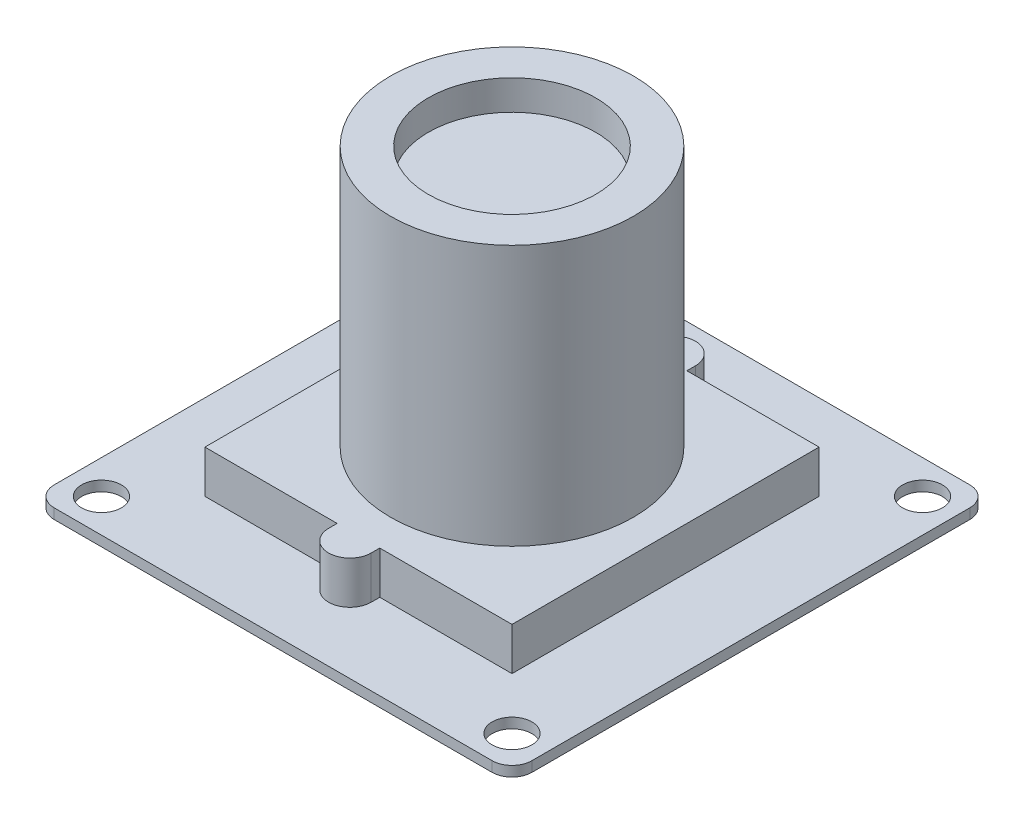
ISO-10303-21;
HEADER;
FILE_DESCRIPTION(('STEP AP214'),'2;1');
FILE_NAME('part.step','',(''),(''),'','','');
FILE_SCHEMA(('AUTOMOTIVE_DESIGN { 1 0 10303 214 1 1 1 1 }'));
ENDSEC;
DATA;
#1=APPLICATION_CONTEXT('core data for automotive mechanical design processes');
#2=APPLICATION_PROTOCOL_DEFINITION('international standard','automotive_design',2000,#1);
#3=PRODUCT_CONTEXT('',#1,'mechanical');
#4=PRODUCT('Part','Part','',(#3));
#5=PRODUCT_RELATED_PRODUCT_CATEGORY('part','',(#4));
#6=PRODUCT_DEFINITION_FORMATION('','',#4);
#7=PRODUCT_DEFINITION_CONTEXT('part definition',#1,'design');
#8=PRODUCT_DEFINITION('design','',#6,#7);
#9=PRODUCT_DEFINITION_SHAPE('','',#8);
#10=(LENGTH_UNIT() NAMED_UNIT(*) SI_UNIT(.MILLI.,.METRE.));
#11=(NAMED_UNIT(*) PLANE_ANGLE_UNIT() SI_UNIT($,.RADIAN.));
#12=(NAMED_UNIT(*) SI_UNIT($,.STERADIAN.) SOLID_ANGLE_UNIT());
#13=UNCERTAINTY_MEASURE_WITH_UNIT(LENGTH_MEASURE(1.E-05),#10,'distance_accuracy_value','');
#14=(GEOMETRIC_REPRESENTATION_CONTEXT(3) GLOBAL_UNCERTAINTY_ASSIGNED_CONTEXT((#13)) GLOBAL_UNIT_ASSIGNED_CONTEXT((#10,
#11,#12)) REPRESENTATION_CONTEXT('',''));
#15=CARTESIAN_POINT('',(0.,0.,0.));
#16=DIRECTION('',(0.,0.,1.));
#17=DIRECTION('',(1.,0.,0.));
#18=AXIS2_PLACEMENT_3D('',#15,#16,#17);
#19=CARTESIAN_POINT('',(0.,3.538,0.));
#20=DIRECTION('',(0.,1.,0.));
#21=DIRECTION('',(0.,0.,1.));
#22=AXIS2_PLACEMENT_3D('',#19,#20,#21);
#23=PLANE('',#22);
#24=CARTESIAN_POINT('',(0.,3.538,10.857));
#25=DIRECTION('',(0.,1.,0.));
#26=DIRECTION('',(0.,0.,1.));
#27=AXIS2_PLACEMENT_3D('',#24,#25,#26);
#28=CIRCLE('',#27,1.42849999999958);
#29=CARTESIAN_POINT('',(-1.42849999999958,3.538,10.857));
#30=VERTEX_POINT('',#29);
#31=CARTESIAN_POINT('',(1.42849999999958,3.538,10.857));
#32=VERTEX_POINT('',#31);
#33=EDGE_CURVE('E261',#30,#32,#28,.T.);
#34=ORIENTED_EDGE('',*,*,#33,.T.);
#35=DIRECTION('',(0.,0.,-1.));
#36=VECTOR('',#35,1.);
#37=CARTESIAN_POINT('',(1.42849999999958,3.538,0.));
#38=LINE('',#37,#36);
#39=CARTESIAN_POINT('',(1.42849999999958,3.538,10.285));
#40=VERTEX_POINT('',#39);
#41=EDGE_CURVE('E263',#32,#40,#38,.T.);
#42=ORIENTED_EDGE('',*,*,#41,.T.);
#43=DIRECTION('',(1.,0.,0.));
#44=VECTOR('',#43,1.);
#45=CARTESIAN_POINT('',(0.,3.538,10.285));
#46=LINE('',#45,#44);
#47=CARTESIAN_POINT('',(10.285,3.538,10.285));
#48=VERTEX_POINT('',#47);
#49=EDGE_CURVE('E258',#40,#48,#46,.T.);
#50=ORIENTED_EDGE('',*,*,#49,.T.);
#51=DIRECTION('',(0.,0.,-1.));
#52=VECTOR('',#51,1.);
#53=CARTESIAN_POINT('',(10.285,3.538,0.));
#54=LINE('',#53,#52);
#55=CARTESIAN_POINT('',(10.285,3.538,-10.285));
#56=VERTEX_POINT('',#55);
#57=EDGE_CURVE('E265',#48,#56,#54,.T.);
#58=ORIENTED_EDGE('',*,*,#57,.T.);
#59=DIRECTION('',(1.,0.,0.));
#60=VECTOR('',#59,1.);
#61=CARTESIAN_POINT('',(0.,3.538,-10.285));
#62=LINE('',#61,#60);
#63=CARTESIAN_POINT('',(1.4285,3.538,-10.285));
#64=VERTEX_POINT('',#63);
#65=EDGE_CURVE('E237',#64,#56,#62,.T.);
#66=ORIENTED_EDGE('',*,*,#65,.F.);
#67=DIRECTION('',(0.,0.,1.));
#68=VECTOR('',#67,1.);
#69=CARTESIAN_POINT('',(1.4285,3.538,0.));
#70=LINE('',#69,#68);
#71=CARTESIAN_POINT('',(1.4285,3.538,-10.857));
#72=VERTEX_POINT('',#71);
#73=EDGE_CURVE('E217',#72,#64,#70,.T.);
#74=ORIENTED_EDGE('',*,*,#73,.F.);
#75=CARTESIAN_POINT('',(0.,3.538,-10.857));
#76=DIRECTION('',(0.,1.,0.));
#77=DIRECTION('',(0.,0.,1.));
#78=AXIS2_PLACEMENT_3D('',#75,#76,#77);
#79=CIRCLE('',#78,1.4285);
#80=CARTESIAN_POINT('',(-1.4285,3.538,-10.857));
#81=VERTEX_POINT('',#80);
#82=EDGE_CURVE('E227',#72,#81,#79,.T.);
#83=ORIENTED_EDGE('',*,*,#82,.T.);
#84=DIRECTION('',(0.,0.,1.));
#85=VECTOR('',#84,1.);
#86=CARTESIAN_POINT('',(-1.4285,3.538,0.));
#87=LINE('',#86,#85);
#88=CARTESIAN_POINT('',(-1.4285,3.538,-10.285));
#89=VERTEX_POINT('',#88);
#90=EDGE_CURVE('E232',#81,#89,#87,.T.);
#91=ORIENTED_EDGE('',*,*,#90,.T.);
#92=CARTESIAN_POINT('',(-10.285,3.538,-10.285));
#93=VERTEX_POINT('',#92);
#94=EDGE_CURVE('E249',#93,#89,#62,.T.);
#95=ORIENTED_EDGE('',*,*,#94,.F.);
#96=DIRECTION('',(0.,0.,-1.));
#97=VECTOR('',#96,1.);
#98=CARTESIAN_POINT('',(-10.285,3.538,0.));
#99=LINE('',#98,#97);
#100=CARTESIAN_POINT('',(-10.285,3.538,10.285));
#101=VERTEX_POINT('',#100);
#102=EDGE_CURVE('E252',#101,#93,#99,.T.);
#103=ORIENTED_EDGE('',*,*,#102,.F.);
#104=CARTESIAN_POINT('',(-1.42849999999958,3.538,10.285));
#105=VERTEX_POINT('',#104);
#106=EDGE_CURVE('E255',#101,#105,#46,.T.);
#107=ORIENTED_EDGE('',*,*,#106,.T.);
#108=DIRECTION('',(0.,0.,-1.));
#109=VECTOR('',#108,1.);
#110=CARTESIAN_POINT('',(-1.42849999999958,3.538,0.));
#111=LINE('',#110,#109);
#112=EDGE_CURVE('E257',#30,#105,#111,.T.);
#113=ORIENTED_EDGE('',*,*,#112,.F.);
#114=EDGE_LOOP('',(#34,#42,#50,#58,#66,#74,#83,#91,#95,#103,#107,#113));
#115=FACE_BOUND('',#114,.T.);
#116=CARTESIAN_POINT('',(0.,3.538,0.));
#117=DIRECTION('',(0.,1.,0.));
#118=DIRECTION('',(0.,0.,1.));
#119=AXIS2_PLACEMENT_3D('',#116,#117,#118);
#120=CIRCLE('',#119,8.1405);
#121=CARTESIAN_POINT('',(0.,3.538,8.1405));
#122=VERTEX_POINT('',#121);
#123=EDGE_CURVE('E245',#122,#122,#120,.T.);
#124=ORIENTED_EDGE('',*,*,#123,.F.);
#125=EDGE_LOOP('',(#124));
#126=FACE_BOUND('',#125,.T.);
#127=ADVANCED_FACE('F74',(#115,#126),#23,.T.);
#128=CARTESIAN_POINT('',(0.,0.681,0.));
#129=DIRECTION('',(0.,-1.,0.));
#130=DIRECTION('',(0.,0.,-1.));
#131=AXIS2_PLACEMENT_3D('',#128,#129,#130);
#132=PLANE('',#131);
#133=DIRECTION('',(0.,0.,-1.));
#134=VECTOR('',#133,1.);
#135=CARTESIAN_POINT('',(16.,0.681,16.));
#136=LINE('',#135,#134);
#137=CARTESIAN_POINT('',(16.,0.681,14.665));
#138=VERTEX_POINT('',#137);
#139=CARTESIAN_POINT('',(16.,0.681,-14.665));
#140=VERTEX_POINT('',#139);
#141=EDGE_CURVE('E328',#138,#140,#136,.T.);
#142=ORIENTED_EDGE('',*,*,#141,.T.);
#143=CARTESIAN_POINT('',(14.665,0.681,-14.665));
#144=DIRECTION('',(0.,-1.,0.));
#145=DIRECTION('',(0.,0.,-1.));
#146=AXIS2_PLACEMENT_3D('',#143,#144,#145);
#147=CIRCLE('',#146,1.335);
#148=CARTESIAN_POINT('',(14.665,0.681,-16.));
#149=VERTEX_POINT('',#148);
#150=EDGE_CURVE('E382',#140,#149,#147,.F.);
#151=ORIENTED_EDGE('',*,*,#150,.T.);
#152=DIRECTION('',(-1.,0.,0.));
#153=VECTOR('',#152,1.);
#154=CARTESIAN_POINT('',(-16.,0.681,-16.));
#155=LINE('',#154,#153);
#156=CARTESIAN_POINT('',(-14.665,0.681,-16.));
#157=VERTEX_POINT('',#156);
#158=EDGE_CURVE('E331',#149,#157,#155,.T.);
#159=ORIENTED_EDGE('',*,*,#158,.T.);
#160=CARTESIAN_POINT('',(-14.665,0.681,-14.665));
#161=DIRECTION('',(0.,-1.,0.));
#162=DIRECTION('',(0.,0.,-1.));
#163=AXIS2_PLACEMENT_3D('',#160,#161,#162);
#164=CIRCLE('',#163,1.335);
#165=CARTESIAN_POINT('',(-16.,0.681,-14.665));
#166=VERTEX_POINT('',#165);
#167=EDGE_CURVE('E376',#157,#166,#164,.F.);
#168=ORIENTED_EDGE('',*,*,#167,.T.);
#169=DIRECTION('',(0.,0.,1.));
#170=VECTOR('',#169,1.);
#171=CARTESIAN_POINT('',(-16.,0.681,16.));
#172=LINE('',#171,#170);
#173=CARTESIAN_POINT('',(-16.,0.681,14.665));
#174=VERTEX_POINT('',#173);
#175=EDGE_CURVE('E335',#166,#174,#172,.T.);
#176=ORIENTED_EDGE('',*,*,#175,.T.);
#177=CARTESIAN_POINT('',(-14.665,0.681,14.665));
#178=DIRECTION('',(0.,-1.,0.));
#179=DIRECTION('',(0.,0.,-1.));
#180=AXIS2_PLACEMENT_3D('',#177,#178,#179);
#181=CIRCLE('',#180,1.335);
#182=CARTESIAN_POINT('',(-14.665,0.681,16.));
#183=VERTEX_POINT('',#182);
#184=EDGE_CURVE('E378',#174,#183,#181,.F.);
#185=ORIENTED_EDGE('',*,*,#184,.T.);
#186=DIRECTION('',(1.,0.,0.));
#187=VECTOR('',#186,1.);
#188=CARTESIAN_POINT('',(-16.,0.681,16.));
#189=LINE('',#188,#187);
#190=CARTESIAN_POINT('',(14.665,0.681,16.));
#191=VERTEX_POINT('',#190);
#192=EDGE_CURVE('E338',#183,#191,#189,.T.);
#193=ORIENTED_EDGE('',*,*,#192,.T.);
#194=CARTESIAN_POINT('',(14.665,0.681,14.665));
#195=DIRECTION('',(0.,-1.,0.));
#196=DIRECTION('',(0.,0.,-1.));
#197=AXIS2_PLACEMENT_3D('',#194,#195,#196);
#198=CIRCLE('',#197,1.335);
#199=EDGE_CURVE('E380',#191,#138,#198,.F.);
#200=ORIENTED_EDGE('',*,*,#199,.T.);
#201=EDGE_LOOP('',(#142,#151,#159,#168,#176,#185,#193,#200));
#202=FACE_BOUND('',#201,.T.);
#203=CARTESIAN_POINT('',(13.75,0.681,-13.75));
#204=DIRECTION('',(0.,1.,0.));
#205=DIRECTION('',(0.,0.,1.));
#206=AXIS2_PLACEMENT_3D('',#203,#204,#205);
#207=CIRCLE('',#206,1.3335);
#208=CARTESIAN_POINT('',(13.75,0.681,-12.4165));
#209=VERTEX_POINT('',#208);
#210=EDGE_CURVE('E324',#209,#209,#207,.T.);
#211=ORIENTED_EDGE('',*,*,#210,.F.);
#212=EDGE_LOOP('',(#211));
#213=FACE_BOUND('',#212,.T.);
#214=CARTESIAN_POINT('',(-13.75,0.681,-13.75));
#215=DIRECTION('',(0.,1.,0.));
#216=DIRECTION('',(0.,0.,1.));
#217=AXIS2_PLACEMENT_3D('',#214,#215,#216);
#218=CIRCLE('',#217,1.3335);
#219=CARTESIAN_POINT('',(-13.75,0.681,-12.4165));
#220=VERTEX_POINT('',#219);
#221=EDGE_CURVE('E320',#220,#220,#218,.T.);
#222=ORIENTED_EDGE('',*,*,#221,.F.);
#223=EDGE_LOOP('',(#222));
#224=FACE_BOUND('',#223,.T.);
#225=CARTESIAN_POINT('',(-13.75,0.681,13.75));
#226=DIRECTION('',(0.,1.,0.));
#227=DIRECTION('',(0.,0.,1.));
#228=AXIS2_PLACEMENT_3D('',#225,#226,#227);
#229=CIRCLE('',#228,1.3335);
#230=CARTESIAN_POINT('',(-13.75,0.681,15.0835));
#231=VERTEX_POINT('',#230);
#232=EDGE_CURVE('E316',#231,#231,#229,.T.);
#233=ORIENTED_EDGE('',*,*,#232,.F.);
#234=EDGE_LOOP('',(#233));
#235=FACE_BOUND('',#234,.T.);
#236=CARTESIAN_POINT('',(13.75,0.681,13.75));
#237=DIRECTION('',(0.,1.,0.));
#238=DIRECTION('',(0.,0.,1.));
#239=AXIS2_PLACEMENT_3D('',#236,#237,#238);
#240=CIRCLE('',#239,1.3335);
#241=CARTESIAN_POINT('',(13.75,0.681,15.0835));
#242=VERTEX_POINT('',#241);
#243=EDGE_CURVE('E223',#242,#242,#240,.T.);
#244=ORIENTED_EDGE('',*,*,#243,.F.);
#245=EDGE_LOOP('',(#244));
#246=FACE_BOUND('',#245,.T.);
#247=CARTESIAN_POINT('',(0.,0.681,10.857));
#248=DIRECTION('',(0.,1.,0.));
#249=DIRECTION('',(0.,0.,1.));
#250=AXIS2_PLACEMENT_3D('',#247,#248,#249);
#251=CIRCLE('',#250,1.42849999999958);
#252=CARTESIAN_POINT('',(-1.42849999999958,0.681,10.857));
#253=VERTEX_POINT('',#252);
#254=CARTESIAN_POINT('',(1.42849999999958,0.681,10.857));
#255=VERTEX_POINT('',#254);
#256=EDGE_CURVE('E283',#253,#255,#251,.T.);
#257=ORIENTED_EDGE('',*,*,#256,.F.);
#258=DIRECTION('',(0.,0.,-1.));
#259=VECTOR('',#258,1.);
#260=CARTESIAN_POINT('',(-1.42849999999958,0.681,0.));
#261=LINE('',#260,#259);
#262=CARTESIAN_POINT('',(-1.42849999999958,0.681,10.285));
#263=VERTEX_POINT('',#262);
#264=EDGE_CURVE('E279',#253,#263,#261,.T.);
#265=ORIENTED_EDGE('',*,*,#264,.T.);
#266=DIRECTION('',(1.,0.,0.));
#267=VECTOR('',#266,1.);
#268=CARTESIAN_POINT('',(0.,0.681,10.285));
#269=LINE('',#268,#267);
#270=CARTESIAN_POINT('',(-10.285,0.681,10.285));
#271=VERTEX_POINT('',#270);
#272=EDGE_CURVE('E89',#271,#263,#269,.T.);
#273=ORIENTED_EDGE('',*,*,#272,.F.);
#274=DIRECTION('',(0.,0.,-1.));
#275=VECTOR('',#274,1.);
#276=CARTESIAN_POINT('',(-10.285,0.681,0.));
#277=LINE('',#276,#275);
#278=CARTESIAN_POINT('',(-10.285,0.681,-10.285));
#279=VERTEX_POINT('',#278);
#280=EDGE_CURVE('E275',#271,#279,#277,.T.);
#281=ORIENTED_EDGE('',*,*,#280,.T.);
#282=DIRECTION('',(1.,0.,0.));
#283=VECTOR('',#282,1.);
#284=CARTESIAN_POINT('',(0.,0.681,-10.285));
#285=LINE('',#284,#283);
#286=CARTESIAN_POINT('',(-1.4285,0.681,-10.285));
#287=VERTEX_POINT('',#286);
#288=EDGE_CURVE('E243',#279,#287,#285,.T.);
#289=ORIENTED_EDGE('',*,*,#288,.T.);
#290=DIRECTION('',(0.,0.,1.));
#291=VECTOR('',#290,1.);
#292=CARTESIAN_POINT('',(-1.4285,0.681,0.));
#293=LINE('',#292,#291);
#294=CARTESIAN_POINT('',(-1.4285,0.681,-10.857));
#295=VERTEX_POINT('',#294);
#296=EDGE_CURVE('E271',#295,#287,#293,.T.);
#297=ORIENTED_EDGE('',*,*,#296,.F.);
#298=CARTESIAN_POINT('',(0.,0.681,-10.857));
#299=DIRECTION('',(0.,1.,0.));
#300=DIRECTION('',(0.,0.,1.));
#301=AXIS2_PLACEMENT_3D('',#298,#299,#300);
#302=CIRCLE('',#301,1.4285);
#303=CARTESIAN_POINT('',(1.4285,0.681,-10.857));
#304=VERTEX_POINT('',#303);
#305=EDGE_CURVE('E268',#304,#295,#302,.T.);
#306=ORIENTED_EDGE('',*,*,#305,.F.);
#307=DIRECTION('',(0.,0.,1.));
#308=VECTOR('',#307,1.);
#309=CARTESIAN_POINT('',(1.4285,0.681,0.));
#310=LINE('',#309,#308);
#311=CARTESIAN_POINT('',(1.4285,0.681,-10.285));
#312=VERTEX_POINT('',#311);
#313=EDGE_CURVE('E220',#304,#312,#310,.T.);
#314=ORIENTED_EDGE('',*,*,#313,.T.);
#315=CARTESIAN_POINT('',(10.285,0.681,-10.285));
#316=VERTEX_POINT('',#315);
#317=EDGE_CURVE('E238',#312,#316,#285,.T.);
#318=ORIENTED_EDGE('',*,*,#317,.T.);
#319=DIRECTION('',(0.,0.,-1.));
#320=VECTOR('',#319,1.);
#321=CARTESIAN_POINT('',(10.285,0.681,0.));
#322=LINE('',#321,#320);
#323=CARTESIAN_POINT('',(10.285,0.681,10.285));
#324=VERTEX_POINT('',#323);
#325=EDGE_CURVE('E241',#324,#316,#322,.T.);
#326=ORIENTED_EDGE('',*,*,#325,.F.);
#327=CARTESIAN_POINT('',(1.42849999999958,0.681,10.285));
#328=VERTEX_POINT('',#327);
#329=EDGE_CURVE('E280',#328,#324,#269,.T.);
#330=ORIENTED_EDGE('',*,*,#329,.F.);
#331=DIRECTION('',(0.,0.,-1.));
#332=VECTOR('',#331,1.);
#333=CARTESIAN_POINT('',(1.42849999999958,0.681,0.));
#334=LINE('',#333,#332);
#335=EDGE_CURVE('E286',#255,#328,#334,.T.);
#336=ORIENTED_EDGE('',*,*,#335,.F.);
#337=EDGE_LOOP('',(#257,#265,#273,#281,#289,#297,#306,#314,#318,#326,#330,#336));
#338=FACE_BOUND('',#337,.T.);
#339=ADVANCED_FACE('F407',(#202,#213,#224,#235,#246,#338),#132,.F.);
#340=CARTESIAN_POINT('',(16.,0.681,16.));
#341=DIRECTION('',(-1.,0.,0.));
#342=DIRECTION('',(0.,0.,1.));
#343=AXIS2_PLACEMENT_3D('',#340,#341,#342);
#344=PLANE('',#343);
#345=DIRECTION('',(0.,0.,-1.));
#346=VECTOR('',#345,1.);
#347=CARTESIAN_POINT('',(16.,0.,16.));
#348=LINE('',#347,#346);
#349=CARTESIAN_POINT('',(16.,0.,14.665));
#350=VERTEX_POINT('',#349);
#351=CARTESIAN_POINT('',(16.,0.,-14.665));
#352=VERTEX_POINT('',#351);
#353=EDGE_CURVE('E341',#350,#352,#348,.T.);
#354=ORIENTED_EDGE('',*,*,#353,.T.);
#355=DIRECTION('',(0.,-1.,0.));
#356=VECTOR('',#355,1.);
#357=CARTESIAN_POINT('',(16.,0.681,-14.665));
#358=LINE('',#357,#356);
#359=EDGE_CURVE('E374',#352,#140,#358,.F.);
#360=ORIENTED_EDGE('',*,*,#359,.T.);
#361=ORIENTED_EDGE('',*,*,#141,.F.);
#362=DIRECTION('',(0.,-1.,0.));
#363=VECTOR('',#362,1.);
#364=CARTESIAN_POINT('',(16.,0.681,14.665));
#365=LINE('',#364,#363);
#366=EDGE_CURVE('E371',#138,#350,#365,.T.);
#367=ORIENTED_EDGE('',*,*,#366,.T.);
#368=EDGE_LOOP('',(#354,#360,#361,#367));
#369=FACE_BOUND('',#368,.T.);
#370=ADVANCED_FACE('F415',(#369),#344,.F.);
#371=CARTESIAN_POINT('',(-16.,0.681,-16.));
#372=DIRECTION('',(0.,0.,1.));
#373=DIRECTION('',(1.,0.,0.));
#374=AXIS2_PLACEMENT_3D('',#371,#372,#373);
#375=PLANE('',#374);
#376=ORIENTED_EDGE('',*,*,#158,.F.);
#377=DIRECTION('',(0.,-1.,0.));
#378=VECTOR('',#377,1.);
#379=CARTESIAN_POINT('',(14.665,0.681,-16.));
#380=LINE('',#379,#378);
#381=CARTESIAN_POINT('',(14.665,0.,-16.));
#382=VERTEX_POINT('',#381);
#383=EDGE_CURVE('E360',#149,#382,#380,.T.);
#384=ORIENTED_EDGE('',*,*,#383,.T.);
#385=DIRECTION('',(-1.,0.,0.));
#386=VECTOR('',#385,1.);
#387=CARTESIAN_POINT('',(-16.,0.,-16.));
#388=LINE('',#387,#386);
#389=CARTESIAN_POINT('',(-14.665,0.,-16.));
#390=VERTEX_POINT('',#389);
#391=EDGE_CURVE('E344',#382,#390,#388,.T.);
#392=ORIENTED_EDGE('',*,*,#391,.T.);
#393=DIRECTION('',(0.,-1.,0.));
#394=VECTOR('',#393,1.);
#395=CARTESIAN_POINT('',(-14.665,0.681,-16.));
#396=LINE('',#395,#394);
#397=EDGE_CURVE('E340',#390,#157,#396,.F.);
#398=ORIENTED_EDGE('',*,*,#397,.T.);
#399=EDGE_LOOP('',(#376,#384,#392,#398));
#400=FACE_BOUND('',#399,.T.);
#401=ADVANCED_FACE('F423',(#400),#375,.F.);
#402=CARTESIAN_POINT('',(-16.,0.681,16.));
#403=DIRECTION('',(1.,0.,0.));
#404=DIRECTION('',(0.,0.,-1.));
#405=AXIS2_PLACEMENT_3D('',#402,#403,#404);
#406=PLANE('',#405);
#407=DIRECTION('',(0.,0.,1.));
#408=VECTOR('',#407,1.);
#409=CARTESIAN_POINT('',(-16.,0.,16.));
#410=LINE('',#409,#408);
#411=CARTESIAN_POINT('',(-16.,0.,-14.665));
#412=VERTEX_POINT('',#411);
#413=CARTESIAN_POINT('',(-16.,0.,14.665));
#414=VERTEX_POINT('',#413);
#415=EDGE_CURVE('E347',#412,#414,#410,.T.);
#416=ORIENTED_EDGE('',*,*,#415,.T.);
#417=DIRECTION('',(0.,-1.,0.));
#418=VECTOR('',#417,1.);
#419=CARTESIAN_POINT('',(-16.,0.681,14.665));
#420=LINE('',#419,#418);
#421=EDGE_CURVE('E12',#414,#174,#420,.F.);
#422=ORIENTED_EDGE('',*,*,#421,.T.);
#423=ORIENTED_EDGE('',*,*,#175,.F.);
#424=DIRECTION('',(0.,-1.,0.));
#425=VECTOR('',#424,1.);
#426=CARTESIAN_POINT('',(-16.,0.681,-14.665));
#427=LINE('',#426,#425);
#428=EDGE_CURVE('E82',#166,#412,#427,.T.);
#429=ORIENTED_EDGE('',*,*,#428,.T.);
#430=EDGE_LOOP('',(#416,#422,#423,#429));
#431=FACE_BOUND('',#430,.T.);
#432=ADVANCED_FACE('F392',(#431),#406,.F.);
#433=CARTESIAN_POINT('',(-16.,0.681,16.));
#434=DIRECTION('',(0.,0.,-1.));
#435=DIRECTION('',(-1.,0.,0.));
#436=AXIS2_PLACEMENT_3D('',#433,#434,#435);
#437=PLANE('',#436);
#438=DIRECTION('',(1.,0.,0.));
#439=VECTOR('',#438,1.);
#440=CARTESIAN_POINT('',(-16.,0.,16.));
#441=LINE('',#440,#439);
#442=CARTESIAN_POINT('',(-14.665,0.,16.));
#443=VERTEX_POINT('',#442);
#444=CARTESIAN_POINT('',(14.665,0.,16.));
#445=VERTEX_POINT('',#444);
#446=EDGE_CURVE('E332',#443,#445,#441,.T.);
#447=ORIENTED_EDGE('',*,*,#446,.T.);
#448=DIRECTION('',(0.,-1.,0.));
#449=VECTOR('',#448,1.);
#450=CARTESIAN_POINT('',(14.665,0.681,16.));
#451=LINE('',#450,#449);
#452=EDGE_CURVE('E97',#445,#191,#451,.F.);
#453=ORIENTED_EDGE('',*,*,#452,.T.);
#454=ORIENTED_EDGE('',*,*,#192,.F.);
#455=DIRECTION('',(0.,-1.,0.));
#456=VECTOR('',#455,1.);
#457=CARTESIAN_POINT('',(-14.665,0.681,16.));
#458=LINE('',#457,#456);
#459=EDGE_CURVE('E384',#183,#443,#458,.T.);
#460=ORIENTED_EDGE('',*,*,#459,.T.);
#461=EDGE_LOOP('',(#447,#453,#454,#460));
#462=FACE_BOUND('',#461,.T.);
#463=ADVANCED_FACE('F404',(#462),#437,.F.);
#464=CARTESIAN_POINT('',(0.,0.,0.));
#465=DIRECTION('',(0.,-1.,0.));
#466=DIRECTION('',(0.,0.,-1.));
#467=AXIS2_PLACEMENT_3D('',#464,#465,#466);
#468=PLANE('',#467);
#469=CARTESIAN_POINT('',(13.75,0.,13.75));
#470=DIRECTION('',(0.,-1.,0.));
#471=DIRECTION('',(0.,0.,-1.));
#472=AXIS2_PLACEMENT_3D('',#469,#470,#471);
#473=CIRCLE('',#472,1.3335);
#474=CARTESIAN_POINT('',(13.75,0.,12.4165));
#475=VERTEX_POINT('',#474);
#476=EDGE_CURVE('E315',#475,#475,#473,.T.);
#477=ORIENTED_EDGE('',*,*,#476,.F.);
#478=EDGE_LOOP('',(#477));
#479=FACE_BOUND('',#478,.T.);
#480=CARTESIAN_POINT('',(-13.75,0.,13.75));
#481=DIRECTION('',(0.,-1.,0.));
#482=DIRECTION('',(0.,0.,-1.));
#483=AXIS2_PLACEMENT_3D('',#480,#481,#482);
#484=CIRCLE('',#483,1.3335);
#485=CARTESIAN_POINT('',(-13.75,0.,12.4165));
#486=VERTEX_POINT('',#485);
#487=EDGE_CURVE('E319',#486,#486,#484,.T.);
#488=ORIENTED_EDGE('',*,*,#487,.F.);
#489=EDGE_LOOP('',(#488));
#490=FACE_BOUND('',#489,.T.);
#491=CARTESIAN_POINT('',(-13.75,0.,-13.75));
#492=DIRECTION('',(0.,-1.,0.));
#493=DIRECTION('',(0.,0.,-1.));
#494=AXIS2_PLACEMENT_3D('',#491,#492,#493);
#495=CIRCLE('',#494,1.3335);
#496=CARTESIAN_POINT('',(-13.75,0.,-15.0835));
#497=VERTEX_POINT('',#496);
#498=EDGE_CURVE('E323',#497,#497,#495,.T.);
#499=ORIENTED_EDGE('',*,*,#498,.F.);
#500=EDGE_LOOP('',(#499));
#501=FACE_BOUND('',#500,.T.);
#502=CARTESIAN_POINT('',(13.75,0.,-13.75));
#503=DIRECTION('',(0.,-1.,0.));
#504=DIRECTION('',(0.,0.,-1.));
#505=AXIS2_PLACEMENT_3D('',#502,#503,#504);
#506=CIRCLE('',#505,1.3335);
#507=CARTESIAN_POINT('',(13.75,0.,-15.0835));
#508=VERTEX_POINT('',#507);
#509=EDGE_CURVE('E327',#508,#508,#506,.T.);
#510=ORIENTED_EDGE('',*,*,#509,.F.);
#511=EDGE_LOOP('',(#510));
#512=FACE_BOUND('',#511,.T.);
#513=ORIENTED_EDGE('',*,*,#391,.F.);
#514=CARTESIAN_POINT('',(14.665,0.,-14.665));
#515=DIRECTION('',(0.,-1.,0.));
#516=DIRECTION('',(0.,0.,-1.));
#517=AXIS2_PLACEMENT_3D('',#514,#515,#516);
#518=CIRCLE('',#517,1.335);
#519=EDGE_CURVE('E369',#382,#352,#518,.T.);
#520=ORIENTED_EDGE('',*,*,#519,.T.);
#521=ORIENTED_EDGE('',*,*,#353,.F.);
#522=CARTESIAN_POINT('',(14.665,0.,14.665));
#523=DIRECTION('',(0.,-1.,0.));
#524=DIRECTION('',(0.,0.,-1.));
#525=AXIS2_PLACEMENT_3D('',#522,#523,#524);
#526=CIRCLE('',#525,1.335);
#527=EDGE_CURVE('E367',#350,#445,#526,.T.);
#528=ORIENTED_EDGE('',*,*,#527,.T.);
#529=ORIENTED_EDGE('',*,*,#446,.F.);
#530=CARTESIAN_POINT('',(-14.665,0.,14.665));
#531=DIRECTION('',(0.,-1.,0.));
#532=DIRECTION('',(0.,0.,-1.));
#533=AXIS2_PLACEMENT_3D('',#530,#531,#532);
#534=CIRCLE('',#533,1.335);
#535=EDGE_CURVE('E365',#443,#414,#534,.T.);
#536=ORIENTED_EDGE('',*,*,#535,.T.);
#537=ORIENTED_EDGE('',*,*,#415,.F.);
#538=CARTESIAN_POINT('',(-14.665,0.,-14.665));
#539=DIRECTION('',(0.,-1.,0.));
#540=DIRECTION('',(0.,0.,-1.));
#541=AXIS2_PLACEMENT_3D('',#538,#539,#540);
#542=CIRCLE('',#541,1.335);
#543=EDGE_CURVE('E363',#412,#390,#542,.T.);
#544=ORIENTED_EDGE('',*,*,#543,.T.);
#545=EDGE_LOOP('',(#513,#520,#521,#528,#529,#536,#537,#544));
#546=FACE_BOUND('',#545,.T.);
#547=ADVANCED_FACE('F398',(#479,#490,#501,#512,#546),#468,.T.);
#548=CARTESIAN_POINT('',(13.75,-0.319,-13.75));
#549=DIRECTION('',(0.,1.,0.));
#550=DIRECTION('',(0.,0.,1.));
#551=AXIS2_PLACEMENT_3D('',#548,#549,#550);
#552=CYLINDRICAL_SURFACE('',#551,1.3335);
#553=ORIENTED_EDGE('',*,*,#509,.T.);
#554=EDGE_LOOP('',(#553));
#555=FACE_BOUND('',#554,.T.);
#556=ORIENTED_EDGE('',*,*,#210,.T.);
#557=EDGE_LOOP('',(#556));
#558=FACE_BOUND('',#557,.T.);
#559=ADVANCED_FACE('F488',(#555,#558),#552,.F.);
#560=CARTESIAN_POINT('',(-13.75,-0.319,-13.75));
#561=DIRECTION('',(0.,1.,0.));
#562=DIRECTION('',(0.,0.,1.));
#563=AXIS2_PLACEMENT_3D('',#560,#561,#562);
#564=CYLINDRICAL_SURFACE('',#563,1.3335);
#565=ORIENTED_EDGE('',*,*,#498,.T.);
#566=EDGE_LOOP('',(#565));
#567=FACE_BOUND('',#566,.T.);
#568=ORIENTED_EDGE('',*,*,#221,.T.);
#569=EDGE_LOOP('',(#568));
#570=FACE_BOUND('',#569,.T.);
#571=ADVANCED_FACE('F484',(#567,#570),#564,.F.);
#572=CARTESIAN_POINT('',(-13.75,-0.319,13.75));
#573=DIRECTION('',(0.,1.,0.));
#574=DIRECTION('',(0.,0.,1.));
#575=AXIS2_PLACEMENT_3D('',#572,#573,#574);
#576=CYLINDRICAL_SURFACE('',#575,1.3335);
#577=ORIENTED_EDGE('',*,*,#487,.T.);
#578=EDGE_LOOP('',(#577));
#579=FACE_BOUND('',#578,.T.);
#580=ORIENTED_EDGE('',*,*,#232,.T.);
#581=EDGE_LOOP('',(#580));
#582=FACE_BOUND('',#581,.T.);
#583=ADVANCED_FACE('F480',(#579,#582),#576,.F.);
#584=CARTESIAN_POINT('',(13.75,-0.319,13.75));
#585=DIRECTION('',(0.,1.,0.));
#586=DIRECTION('',(0.,0.,1.));
#587=AXIS2_PLACEMENT_3D('',#584,#585,#586);
#588=CYLINDRICAL_SURFACE('',#587,1.3335);
#589=ORIENTED_EDGE('',*,*,#476,.T.);
#590=EDGE_LOOP('',(#589));
#591=FACE_BOUND('',#590,.T.);
#592=ORIENTED_EDGE('',*,*,#243,.T.);
#593=EDGE_LOOP('',(#592));
#594=FACE_BOUND('',#593,.T.);
#595=ADVANCED_FACE('F477',(#591,#594),#588,.F.);
#596=CARTESIAN_POINT('',(14.665,0.681,-14.665));
#597=DIRECTION('',(0.,-1.,0.));
#598=DIRECTION('',(0.,0.,-1.));
#599=AXIS2_PLACEMENT_3D('',#596,#597,#598);
#600=CYLINDRICAL_SURFACE('',#599,1.335);
#601=ORIENTED_EDGE('',*,*,#150,.F.);
#602=ORIENTED_EDGE('',*,*,#359,.F.);
#603=ORIENTED_EDGE('',*,*,#519,.F.);
#604=ORIENTED_EDGE('',*,*,#383,.F.);
#605=EDGE_LOOP('',(#601,#602,#603,#604));
#606=FACE_BOUND('',#605,.T.);
#607=ADVANCED_FACE('F420',(#606),#600,.T.);
#608=CARTESIAN_POINT('',(14.665,0.681,14.665));
#609=DIRECTION('',(0.,-1.,0.));
#610=DIRECTION('',(0.,0.,-1.));
#611=AXIS2_PLACEMENT_3D('',#608,#609,#610);
#612=CYLINDRICAL_SURFACE('',#611,1.335);
#613=ORIENTED_EDGE('',*,*,#199,.F.);
#614=ORIENTED_EDGE('',*,*,#452,.F.);
#615=ORIENTED_EDGE('',*,*,#527,.F.);
#616=ORIENTED_EDGE('',*,*,#366,.F.);
#617=EDGE_LOOP('',(#613,#614,#615,#616));
#618=FACE_BOUND('',#617,.T.);
#619=ADVANCED_FACE('F412',(#618),#612,.T.);
#620=CARTESIAN_POINT('',(-14.665,0.681,14.665));
#621=DIRECTION('',(0.,-1.,0.));
#622=DIRECTION('',(0.,0.,-1.));
#623=AXIS2_PLACEMENT_3D('',#620,#621,#622);
#624=CYLINDRICAL_SURFACE('',#623,1.335);
#625=ORIENTED_EDGE('',*,*,#184,.F.);
#626=ORIENTED_EDGE('',*,*,#421,.F.);
#627=ORIENTED_EDGE('',*,*,#535,.F.);
#628=ORIENTED_EDGE('',*,*,#459,.F.);
#629=EDGE_LOOP('',(#625,#626,#627,#628));
#630=FACE_BOUND('',#629,.T.);
#631=ADVANCED_FACE('F403',(#630),#624,.T.);
#632=CARTESIAN_POINT('',(-14.665,0.681,-14.665));
#633=DIRECTION('',(0.,-1.,0.));
#634=DIRECTION('',(0.,0.,-1.));
#635=AXIS2_PLACEMENT_3D('',#632,#633,#634);
#636=CYLINDRICAL_SURFACE('',#635,1.335);
#637=ORIENTED_EDGE('',*,*,#167,.F.);
#638=ORIENTED_EDGE('',*,*,#397,.F.);
#639=ORIENTED_EDGE('',*,*,#543,.F.);
#640=ORIENTED_EDGE('',*,*,#428,.F.);
#641=EDGE_LOOP('',(#637,#638,#639,#640));
#642=FACE_BOUND('',#641,.T.);
#643=ADVANCED_FACE('F76',(#642),#636,.T.);
#644=CARTESIAN_POINT('',(0.,3.538,10.857));
#645=DIRECTION('',(0.,-1.,0.));
#646=DIRECTION('',(0.,0.,-1.));
#647=AXIS2_PLACEMENT_3D('',#644,#645,#646);
#648=CYLINDRICAL_SURFACE('',#647,1.42849999999958);
#649=ORIENTED_EDGE('',*,*,#256,.T.);
#650=DIRECTION('',(0.,-1.,0.));
#651=VECTOR('',#650,1.);
#652=CARTESIAN_POINT('',(1.42849999999958,3.538,10.857));
#653=LINE('',#652,#651);
#654=EDGE_CURVE('E300',#32,#255,#653,.T.);
#655=ORIENTED_EDGE('',*,*,#654,.F.);
#656=ORIENTED_EDGE('',*,*,#33,.F.);
#657=DIRECTION('',(0.,-1.,0.));
#658=VECTOR('',#657,1.);
#659=CARTESIAN_POINT('',(-1.42849999999958,3.538,10.857));
#660=LINE('',#659,#658);
#661=EDGE_CURVE('E302',#30,#253,#660,.T.);
#662=ORIENTED_EDGE('',*,*,#661,.T.);
#663=EDGE_LOOP('',(#649,#655,#656,#662));
#664=FACE_BOUND('',#663,.T.);
#665=ADVANCED_FACE('F426',(#664),#648,.T.);
#666=CARTESIAN_POINT('',(1.42849999999958,3.538,0.));
#667=DIRECTION('',(-1.,0.,0.));
#668=DIRECTION('',(0.,0.,1.));
#669=AXIS2_PLACEMENT_3D('',#666,#667,#668);
#670=PLANE('',#669);
#671=ORIENTED_EDGE('',*,*,#335,.T.);
#672=DIRECTION('',(0.,-1.,0.));
#673=VECTOR('',#672,1.);
#674=CARTESIAN_POINT('',(1.42849999999958,3.538,10.285));
#675=LINE('',#674,#673);
#676=EDGE_CURVE('E297',#40,#328,#675,.T.);
#677=ORIENTED_EDGE('',*,*,#676,.F.);
#678=ORIENTED_EDGE('',*,*,#41,.F.);
#679=ORIENTED_EDGE('',*,*,#654,.T.);
#680=EDGE_LOOP('',(#671,#677,#678,#679));
#681=FACE_BOUND('',#680,.T.);
#682=ADVANCED_FACE('F431',(#681),#670,.F.);
#683=CARTESIAN_POINT('',(0.,3.538,10.285));
#684=DIRECTION('',(0.,0.,-1.));
#685=DIRECTION('',(-1.,0.,0.));
#686=AXIS2_PLACEMENT_3D('',#683,#684,#685);
#687=PLANE('',#686);
#688=ORIENTED_EDGE('',*,*,#329,.T.);
#689=DIRECTION('',(0.,-1.,0.));
#690=VECTOR('',#689,1.);
#691=CARTESIAN_POINT('',(10.285,3.538,10.285));
#692=LINE('',#691,#690);
#693=EDGE_CURVE('E294',#48,#324,#692,.T.);
#694=ORIENTED_EDGE('',*,*,#693,.F.);
#695=ORIENTED_EDGE('',*,*,#49,.F.);
#696=ORIENTED_EDGE('',*,*,#676,.T.);
#697=EDGE_LOOP('',(#688,#694,#695,#696));
#698=FACE_BOUND('',#697,.T.);
#699=ADVANCED_FACE('F452',(#698),#687,.F.);
#700=CARTESIAN_POINT('',(10.285,3.538,0.));
#701=DIRECTION('',(-1.,0.,0.));
#702=DIRECTION('',(0.,0.,1.));
#703=AXIS2_PLACEMENT_3D('',#700,#701,#702);
#704=PLANE('',#703);
#705=ORIENTED_EDGE('',*,*,#325,.T.);
#706=DIRECTION('',(0.,-1.,0.));
#707=VECTOR('',#706,1.);
#708=CARTESIAN_POINT('',(10.285,3.538,-10.285));
#709=LINE('',#708,#707);
#710=EDGE_CURVE('E292',#56,#316,#709,.T.);
#711=ORIENTED_EDGE('',*,*,#710,.F.);
#712=ORIENTED_EDGE('',*,*,#57,.F.);
#713=ORIENTED_EDGE('',*,*,#693,.T.);
#714=EDGE_LOOP('',(#705,#711,#712,#713));
#715=FACE_BOUND('',#714,.T.);
#716=ADVANCED_FACE('F447',(#715),#704,.F.);
#717=CARTESIAN_POINT('',(0.,3.538,-10.285));
#718=DIRECTION('',(0.,0.,-1.));
#719=DIRECTION('',(-1.,0.,0.));
#720=AXIS2_PLACEMENT_3D('',#717,#718,#719);
#721=PLANE('',#720);
#722=ORIENTED_EDGE('',*,*,#317,.F.);
#723=DIRECTION('',(0.,-1.,0.));
#724=VECTOR('',#723,1.);
#725=CARTESIAN_POINT('',(1.4285,3.538,-10.285));
#726=LINE('',#725,#724);
#727=EDGE_CURVE('E290',#64,#312,#726,.T.);
#728=ORIENTED_EDGE('',*,*,#727,.F.);
#729=ORIENTED_EDGE('',*,*,#65,.T.);
#730=ORIENTED_EDGE('',*,*,#710,.T.);
#731=EDGE_LOOP('',(#722,#728,#729,#730));
#732=FACE_BOUND('',#731,.T.);
#733=ADVANCED_FACE('F444',(#732),#721,.T.);
#734=CARTESIAN_POINT('',(1.4285,3.538,0.));
#735=DIRECTION('',(1.,0.,0.));
#736=DIRECTION('',(0.,0.,-1.));
#737=AXIS2_PLACEMENT_3D('',#734,#735,#736);
#738=PLANE('',#737);
#739=ORIENTED_EDGE('',*,*,#313,.F.);
#740=DIRECTION('',(0.,-1.,0.));
#741=VECTOR('',#740,1.);
#742=CARTESIAN_POINT('',(1.4285,3.538,-10.857));
#743=LINE('',#742,#741);
#744=EDGE_CURVE('E213',#72,#304,#743,.T.);
#745=ORIENTED_EDGE('',*,*,#744,.F.);
#746=ORIENTED_EDGE('',*,*,#73,.T.);
#747=ORIENTED_EDGE('',*,*,#727,.T.);
#748=EDGE_LOOP('',(#739,#745,#746,#747));
#749=FACE_BOUND('',#748,.T.);
#750=ADVANCED_FACE('F215',(#749),#738,.T.);
#751=CARTESIAN_POINT('',(0.,3.538,-10.857));
#752=DIRECTION('',(0.,-1.,0.));
#753=DIRECTION('',(0.,0.,-1.));
#754=AXIS2_PLACEMENT_3D('',#751,#752,#753);
#755=CYLINDRICAL_SURFACE('',#754,1.4285);
#756=ORIENTED_EDGE('',*,*,#305,.T.);
#757=DIRECTION('',(0.,-1.,0.));
#758=VECTOR('',#757,1.);
#759=CARTESIAN_POINT('',(-1.4285,3.538,-10.857));
#760=LINE('',#759,#758);
#761=EDGE_CURVE('E224',#81,#295,#760,.T.);
#762=ORIENTED_EDGE('',*,*,#761,.F.);
#763=ORIENTED_EDGE('',*,*,#82,.F.);
#764=ORIENTED_EDGE('',*,*,#744,.T.);
#765=EDGE_LOOP('',(#756,#762,#763,#764));
#766=FACE_BOUND('',#765,.T.);
#767=ADVANCED_FACE('F228',(#766),#755,.T.);
#768=CARTESIAN_POINT('',(-1.4285,3.538,0.));
#769=DIRECTION('',(1.,0.,0.));
#770=DIRECTION('',(0.,0.,-1.));
#771=AXIS2_PLACEMENT_3D('',#768,#769,#770);
#772=PLANE('',#771);
#773=ORIENTED_EDGE('',*,*,#296,.T.);
#774=DIRECTION('',(0.,-1.,0.));
#775=VECTOR('',#774,1.);
#776=CARTESIAN_POINT('',(-1.4285,3.538,-10.285));
#777=LINE('',#776,#775);
#778=EDGE_CURVE('E310',#89,#287,#777,.T.);
#779=ORIENTED_EDGE('',*,*,#778,.F.);
#780=ORIENTED_EDGE('',*,*,#90,.F.);
#781=ORIENTED_EDGE('',*,*,#761,.T.);
#782=EDGE_LOOP('',(#773,#779,#780,#781));
#783=FACE_BOUND('',#782,.T.);
#784=ADVANCED_FACE('F469',(#783),#772,.F.);
#785=ORIENTED_EDGE('',*,*,#288,.F.);
#786=DIRECTION('',(0.,-1.,0.));
#787=VECTOR('',#786,1.);
#788=CARTESIAN_POINT('',(-10.285,3.538,-10.285));
#789=LINE('',#788,#787);
#790=EDGE_CURVE('E308',#93,#279,#789,.T.);
#791=ORIENTED_EDGE('',*,*,#790,.F.);
#792=ORIENTED_EDGE('',*,*,#94,.T.);
#793=ORIENTED_EDGE('',*,*,#778,.T.);
#794=EDGE_LOOP('',(#785,#791,#792,#793));
#795=FACE_BOUND('',#794,.T.);
#796=ADVANCED_FACE('F449',(#795),#721,.T.);
#797=CARTESIAN_POINT('',(-10.285,3.538,0.));
#798=DIRECTION('',(-1.,0.,0.));
#799=DIRECTION('',(0.,0.,1.));
#800=AXIS2_PLACEMENT_3D('',#797,#798,#799);
#801=PLANE('',#800);
#802=ORIENTED_EDGE('',*,*,#280,.F.);
#803=DIRECTION('',(0.,-1.,0.));
#804=VECTOR('',#803,1.);
#805=CARTESIAN_POINT('',(-10.285,3.538,10.285));
#806=LINE('',#805,#804);
#807=EDGE_CURVE('E306',#101,#271,#806,.T.);
#808=ORIENTED_EDGE('',*,*,#807,.F.);
#809=ORIENTED_EDGE('',*,*,#102,.T.);
#810=ORIENTED_EDGE('',*,*,#790,.T.);
#811=EDGE_LOOP('',(#802,#808,#809,#810));
#812=FACE_BOUND('',#811,.T.);
#813=ADVANCED_FACE('F465',(#812),#801,.T.);
#814=ORIENTED_EDGE('',*,*,#272,.T.);
#815=DIRECTION('',(0.,-1.,0.));
#816=VECTOR('',#815,1.);
#817=CARTESIAN_POINT('',(-1.42849999999958,3.538,10.285));
#818=LINE('',#817,#816);
#819=EDGE_CURVE('E304',#105,#263,#818,.T.);
#820=ORIENTED_EDGE('',*,*,#819,.F.);
#821=ORIENTED_EDGE('',*,*,#106,.F.);
#822=ORIENTED_EDGE('',*,*,#807,.T.);
#823=EDGE_LOOP('',(#814,#820,#821,#822));
#824=FACE_BOUND('',#823,.T.);
#825=ADVANCED_FACE('F457',(#824),#687,.F.);
#826=CARTESIAN_POINT('',(-1.42849999999958,3.538,0.));
#827=DIRECTION('',(-1.,0.,0.));
#828=DIRECTION('',(0.,0.,1.));
#829=AXIS2_PLACEMENT_3D('',#826,#827,#828);
#830=PLANE('',#829);
#831=ORIENTED_EDGE('',*,*,#264,.F.);
#832=ORIENTED_EDGE('',*,*,#661,.F.);
#833=ORIENTED_EDGE('',*,*,#112,.T.);
#834=ORIENTED_EDGE('',*,*,#819,.T.);
#835=EDGE_LOOP('',(#831,#832,#833,#834));
#836=FACE_BOUND('',#835,.T.);
#837=ADVANCED_FACE('F461',(#836),#830,.T.);
#838=CARTESIAN_POINT('',(0.,20.998,0.));
#839=DIRECTION('',(0.,-1.,0.));
#840=DIRECTION('',(0.,0.,-1.));
#841=AXIS2_PLACEMENT_3D('',#838,#839,#840);
#842=CYLINDRICAL_SURFACE('',#841,8.1405);
#843=CARTESIAN_POINT('',(0.,20.998,0.));
#844=DIRECTION('',(0.,1.,0.));
#845=DIRECTION('',(0.,0.,1.));
#846=AXIS2_PLACEMENT_3D('',#843,#844,#845);
#847=CIRCLE('',#846,8.1405);
#848=CARTESIAN_POINT('',(0.,20.998,8.1405));
#849=VERTEX_POINT('',#848);
#850=EDGE_CURVE('E269',#849,#849,#847,.T.);
#851=ORIENTED_EDGE('',*,*,#850,.F.);
#852=EDGE_LOOP('',(#851));
#853=FACE_BOUND('',#852,.T.);
#854=ORIENTED_EDGE('',*,*,#123,.T.);
#855=EDGE_LOOP('',(#854));
#856=FACE_BOUND('',#855,.T.);
#857=ADVANCED_FACE('F442',(#853,#856),#842,.T.);
#858=CARTESIAN_POINT('',(0.,20.998,0.));
#859=DIRECTION('',(0.,1.,0.));
#860=DIRECTION('',(0.,0.,1.));
#861=AXIS2_PLACEMENT_3D('',#858,#859,#860);
#862=PLANE('',#861);
#863=CARTESIAN_POINT('',(0.,20.998,0.));
#864=DIRECTION('',(0.,1.,0.));
#865=DIRECTION('',(0.,0.,1.));
#866=AXIS2_PLACEMENT_3D('',#863,#864,#865);
#867=CIRCLE('',#866,5.6075);
#868=CARTESIAN_POINT('',(0.,20.998,5.6075));
#869=VERTEX_POINT('',#868);
#870=EDGE_CURVE('E651',#869,#869,#867,.T.);
#871=ORIENTED_EDGE('',*,*,#870,.F.);
#872=EDGE_LOOP('',(#871));
#873=FACE_BOUND('',#872,.T.);
#874=ORIENTED_EDGE('',*,*,#850,.T.);
#875=EDGE_LOOP('',(#874));
#876=FACE_BOUND('',#875,.T.);
#877=ADVANCED_FACE('F616',(#873,#876),#862,.T.);
#878=CARTESIAN_POINT('',(0.,18.998,0.));
#879=DIRECTION('',(0.,1.,0.));
#880=DIRECTION('',(0.,0.,1.));
#881=AXIS2_PLACEMENT_3D('',#878,#879,#880);
#882=CYLINDRICAL_SURFACE('',#881,5.6075);
#883=CARTESIAN_POINT('',(0.,18.998,0.));
#884=DIRECTION('',(0.,1.,0.));
#885=DIRECTION('',(0.,0.,1.));
#886=AXIS2_PLACEMENT_3D('',#883,#884,#885);
#887=CIRCLE('',#886,5.6075);
#888=CARTESIAN_POINT('',(0.,18.998,5.6075));
#889=VERTEX_POINT('',#888);
#890=EDGE_CURVE('E650',#889,#889,#887,.T.);
#891=ORIENTED_EDGE('',*,*,#890,.F.);
#892=EDGE_LOOP('',(#891));
#893=FACE_BOUND('',#892,.T.);
#894=ORIENTED_EDGE('',*,*,#870,.T.);
#895=EDGE_LOOP('',(#894));
#896=FACE_BOUND('',#895,.T.);
#897=ADVANCED_FACE('F625',(#893,#896),#882,.F.);
#898=CARTESIAN_POINT('',(0.,18.998,0.));
#899=DIRECTION('',(0.,1.,0.));
#900=DIRECTION('',(0.,0.,1.));
#901=AXIS2_PLACEMENT_3D('',#898,#899,#900);
#902=PLANE('',#901);
#903=ORIENTED_EDGE('',*,*,#890,.T.);
#904=EDGE_LOOP('',(#903));
#905=FACE_BOUND('',#904,.T.);
#906=ADVANCED_FACE('F634',(#905),#902,.T.);
#907=CLOSED_SHELL('',(#127,#339,#370,#401,#432,#463,#547,#559,#571,#583,#595,#607,#619,#631,
#643,#665,#682,#699,#716,#733,#750,#767,#784,#796,#813,#825,#837,#857,#877,#897,#906));
#908=MANIFOLD_SOLID_BREP('B2',#907);
#909=ADVANCED_BREP_SHAPE_REPRESENTATION('',(#18,#908),#14);
#910=SHAPE_DEFINITION_REPRESENTATION(#9,#909);
ENDSEC;
END-ISO-10303-21;
